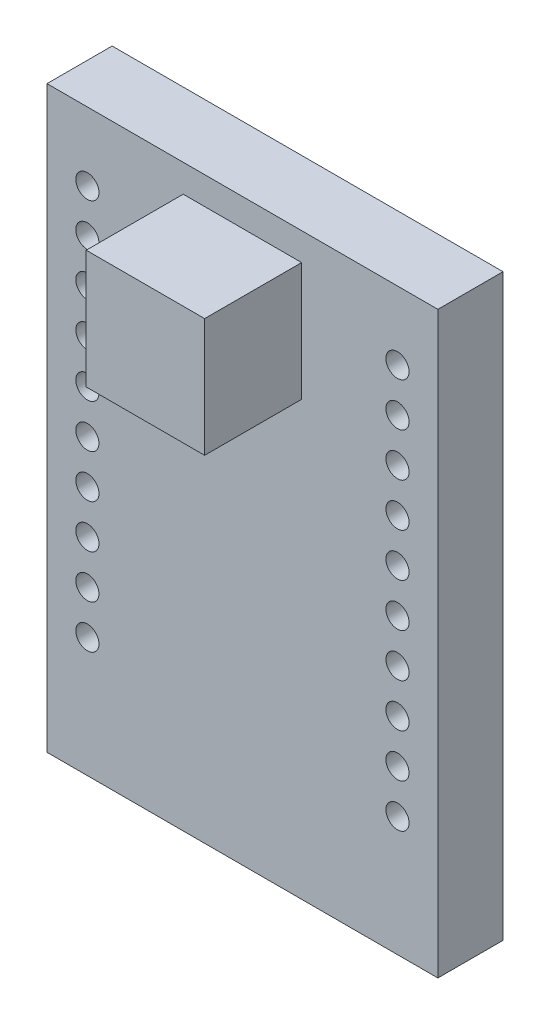
ISO-10303-21;
HEADER;
FILE_DESCRIPTION(('STEP AP214'),'2;1');
FILE_NAME('part.step','',(''),(''),'','','');
FILE_SCHEMA(('AUTOMOTIVE_DESIGN { 1 0 10303 214 1 1 1 1 }'));
ENDSEC;
DATA;
#1=APPLICATION_CONTEXT('core data for automotive mechanical design processes');
#2=APPLICATION_PROTOCOL_DEFINITION('international standard','automotive_design',2000,#1);
#3=PRODUCT_CONTEXT('',#1,'mechanical');
#4=PRODUCT('Part','Part','',(#3));
#5=PRODUCT_RELATED_PRODUCT_CATEGORY('part','',(#4));
#6=PRODUCT_DEFINITION_FORMATION('','',#4);
#7=PRODUCT_DEFINITION_CONTEXT('part definition',#1,'design');
#8=PRODUCT_DEFINITION('design','',#6,#7);
#9=PRODUCT_DEFINITION_SHAPE('','',#8);
#10=(LENGTH_UNIT() NAMED_UNIT(*) SI_UNIT(.MILLI.,.METRE.));
#11=(NAMED_UNIT(*) PLANE_ANGLE_UNIT() SI_UNIT($,.RADIAN.));
#12=(NAMED_UNIT(*) SI_UNIT($,.STERADIAN.) SOLID_ANGLE_UNIT());
#13=UNCERTAINTY_MEASURE_WITH_UNIT(LENGTH_MEASURE(1.E-05),#10,'distance_accuracy_value','');
#14=(GEOMETRIC_REPRESENTATION_CONTEXT(3) GLOBAL_UNCERTAINTY_ASSIGNED_CONTEXT((#13)) GLOBAL_UNIT_ASSIGNED_CONTEXT((#10,
#11,#12)) REPRESENTATION_CONTEXT('',''));
#15=CARTESIAN_POINT('',(0.,0.,0.));
#16=DIRECTION('',(0.,0.,1.));
#17=DIRECTION('',(1.,0.,0.));
#18=AXIS2_PLACEMENT_3D('',#15,#16,#17);
#19=CARTESIAN_POINT('',(0.,0.,4.5));
#20=DIRECTION('',(0.,0.,1.));
#21=DIRECTION('',(1.,0.,0.));
#22=AXIS2_PLACEMENT_3D('',#19,#20,#21);
#23=PLANE('',#22);
#24=CARTESIAN_POINT('',(-10.7092898997726,15.2710613434894,4.5));
#25=DIRECTION('',(0.,0.,-1.));
#26=DIRECTION('',(-1.,0.,0.));
#27=AXIS2_PLACEMENT_3D('',#24,#25,#26);
#28=CIRCLE('',#27,0.800000000000001);
#29=CARTESIAN_POINT('',(-11.5092898997726,15.2710613434894,4.5));
#30=VERTEX_POINT('',#29);
#31=EDGE_CURVE('E228',#30,#30,#28,.T.);
#32=ORIENTED_EDGE('',*,*,#31,.T.);
#33=EDGE_LOOP('',(#32));
#34=FACE_BOUND('',#33,.T.);
#35=CARTESIAN_POINT('',(-10.7092898997726,12.2710613434894,4.5));
#36=DIRECTION('',(0.,0.,-1.));
#37=DIRECTION('',(-1.,0.,0.));
#38=AXIS2_PLACEMENT_3D('',#35,#36,#37);
#39=CIRCLE('',#38,0.800000000000001);
#40=CARTESIAN_POINT('',(-11.5092898997726,12.2710613434894,4.5));
#41=VERTEX_POINT('',#40);
#42=EDGE_CURVE('E358',#41,#41,#39,.T.);
#43=ORIENTED_EDGE('',*,*,#42,.T.);
#44=EDGE_LOOP('',(#43));
#45=FACE_BOUND('',#44,.T.);
#46=CARTESIAN_POINT('',(-10.7092898997726,9.27106134348941,4.5));
#47=DIRECTION('',(0.,0.,-1.));
#48=DIRECTION('',(-1.,0.,0.));
#49=AXIS2_PLACEMENT_3D('',#46,#47,#48);
#50=CIRCLE('',#49,0.800000000000001);
#51=CARTESIAN_POINT('',(-11.5092898997726,9.27106134348941,4.5));
#52=VERTEX_POINT('',#51);
#53=EDGE_CURVE('E354',#52,#52,#50,.T.);
#54=ORIENTED_EDGE('',*,*,#53,.T.);
#55=EDGE_LOOP('',(#54));
#56=FACE_BOUND('',#55,.T.);
#57=CARTESIAN_POINT('',(-10.7092898997726,6.27106134348941,4.5));
#58=DIRECTION('',(0.,0.,-1.));
#59=DIRECTION('',(-1.,0.,0.));
#60=AXIS2_PLACEMENT_3D('',#57,#58,#59);
#61=CIRCLE('',#60,0.800000000000001);
#62=CARTESIAN_POINT('',(-11.5092898997726,6.27106134348941,4.5));
#63=VERTEX_POINT('',#62);
#64=EDGE_CURVE('E350',#63,#63,#61,.T.);
#65=ORIENTED_EDGE('',*,*,#64,.T.);
#66=EDGE_LOOP('',(#65));
#67=FACE_BOUND('',#66,.T.);
#68=CARTESIAN_POINT('',(-10.7092898997726,3.27106134348941,4.5));
#69=DIRECTION('',(0.,0.,-1.));
#70=DIRECTION('',(-1.,0.,0.));
#71=AXIS2_PLACEMENT_3D('',#68,#69,#70);
#72=CIRCLE('',#71,0.800000000000001);
#73=CARTESIAN_POINT('',(-11.5092898997726,3.27106134348941,4.5));
#74=VERTEX_POINT('',#73);
#75=EDGE_CURVE('E346',#74,#74,#72,.T.);
#76=ORIENTED_EDGE('',*,*,#75,.T.);
#77=EDGE_LOOP('',(#76));
#78=FACE_BOUND('',#77,.T.);
#79=CARTESIAN_POINT('',(-10.7092898997726,0.27106134348941,4.5));
#80=DIRECTION('',(0.,0.,-1.));
#81=DIRECTION('',(-1.,0.,0.));
#82=AXIS2_PLACEMENT_3D('',#79,#80,#81);
#83=CIRCLE('',#82,0.800000000000001);
#84=CARTESIAN_POINT('',(-11.5092898997726,0.27106134348941,4.5));
#85=VERTEX_POINT('',#84);
#86=EDGE_CURVE('E342',#85,#85,#83,.T.);
#87=ORIENTED_EDGE('',*,*,#86,.T.);
#88=EDGE_LOOP('',(#87));
#89=FACE_BOUND('',#88,.T.);
#90=CARTESIAN_POINT('',(-10.7092898997726,-2.72893865651059,4.5));
#91=DIRECTION('',(0.,0.,-1.));
#92=DIRECTION('',(-1.,0.,0.));
#93=AXIS2_PLACEMENT_3D('',#90,#91,#92);
#94=CIRCLE('',#93,0.800000000000001);
#95=CARTESIAN_POINT('',(-11.5092898997726,-2.72893865651059,4.5));
#96=VERTEX_POINT('',#95);
#97=EDGE_CURVE('E338',#96,#96,#94,.T.);
#98=ORIENTED_EDGE('',*,*,#97,.T.);
#99=EDGE_LOOP('',(#98));
#100=FACE_BOUND('',#99,.T.);
#101=CARTESIAN_POINT('',(-10.7092898997726,-5.72893865651059,4.5));
#102=DIRECTION('',(0.,0.,-1.));
#103=DIRECTION('',(-1.,0.,0.));
#104=AXIS2_PLACEMENT_3D('',#101,#102,#103);
#105=CIRCLE('',#104,0.800000000000001);
#106=CARTESIAN_POINT('',(-11.5092898997726,-5.72893865651059,4.5));
#107=VERTEX_POINT('',#106);
#108=EDGE_CURVE('E334',#107,#107,#105,.T.);
#109=ORIENTED_EDGE('',*,*,#108,.T.);
#110=EDGE_LOOP('',(#109));
#111=FACE_BOUND('',#110,.T.);
#112=CARTESIAN_POINT('',(-10.7092898997726,-8.72893865651059,4.5));
#113=DIRECTION('',(0.,0.,-1.));
#114=DIRECTION('',(-1.,0.,0.));
#115=AXIS2_PLACEMENT_3D('',#112,#113,#114);
#116=CIRCLE('',#115,0.800000000000001);
#117=CARTESIAN_POINT('',(-11.5092898997726,-8.72893865651059,4.5));
#118=VERTEX_POINT('',#117);
#119=EDGE_CURVE('E330',#118,#118,#116,.T.);
#120=ORIENTED_EDGE('',*,*,#119,.T.);
#121=EDGE_LOOP('',(#120));
#122=FACE_BOUND('',#121,.T.);
#123=CARTESIAN_POINT('',(-10.7092898997726,-11.7289386565106,4.5));
#124=DIRECTION('',(0.,0.,-1.));
#125=DIRECTION('',(-1.,0.,0.));
#126=AXIS2_PLACEMENT_3D('',#123,#124,#125);
#127=CIRCLE('',#126,0.800000000000001);
#128=CARTESIAN_POINT('',(-11.5092898997726,-11.7289386565106,4.5));
#129=VERTEX_POINT('',#128);
#130=EDGE_CURVE('E326',#129,#129,#127,.T.);
#131=ORIENTED_EDGE('',*,*,#130,.T.);
#132=EDGE_LOOP('',(#131));
#133=FACE_BOUND('',#132,.T.);
#134=CARTESIAN_POINT('',(10.7092898997726,15.2710613434894,4.5));
#135=DIRECTION('',(0.,0.,1.));
#136=DIRECTION('',(1.,0.,0.));
#137=AXIS2_PLACEMENT_3D('',#134,#135,#136);
#138=CIRCLE('',#137,0.800000000000001);
#139=CARTESIAN_POINT('',(11.5092898997726,15.2710613434894,4.5));
#140=VERTEX_POINT('',#139);
#141=EDGE_CURVE('E187',#140,#140,#138,.T.);
#142=ORIENTED_EDGE('',*,*,#141,.F.);
#143=EDGE_LOOP('',(#142));
#144=FACE_BOUND('',#143,.T.);
#145=CARTESIAN_POINT('',(10.7092898997726,12.2710613434894,4.5));
#146=DIRECTION('',(0.,0.,1.));
#147=DIRECTION('',(1.,0.,0.));
#148=AXIS2_PLACEMENT_3D('',#145,#146,#147);
#149=CIRCLE('',#148,0.800000000000001);
#150=CARTESIAN_POINT('',(11.5092898997726,12.2710613434894,4.5));
#151=VERTEX_POINT('',#150);
#152=EDGE_CURVE('E297',#151,#151,#149,.T.);
#153=ORIENTED_EDGE('',*,*,#152,.F.);
#154=EDGE_LOOP('',(#153));
#155=FACE_BOUND('',#154,.T.);
#156=CARTESIAN_POINT('',(10.7092898997726,9.27106134348941,4.5));
#157=DIRECTION('',(0.,0.,1.));
#158=DIRECTION('',(1.,0.,0.));
#159=AXIS2_PLACEMENT_3D('',#156,#157,#158);
#160=CIRCLE('',#159,0.800000000000001);
#161=CARTESIAN_POINT('',(11.5092898997726,9.27106134348941,4.5));
#162=VERTEX_POINT('',#161);
#163=EDGE_CURVE('E301',#162,#162,#160,.T.);
#164=ORIENTED_EDGE('',*,*,#163,.F.);
#165=EDGE_LOOP('',(#164));
#166=FACE_BOUND('',#165,.T.);
#167=CARTESIAN_POINT('',(10.7092898997726,6.27106134348941,4.5));
#168=DIRECTION('',(0.,0.,1.));
#169=DIRECTION('',(1.,0.,0.));
#170=AXIS2_PLACEMENT_3D('',#167,#168,#169);
#171=CIRCLE('',#170,0.800000000000001);
#172=CARTESIAN_POINT('',(11.5092898997726,6.27106134348941,4.5));
#173=VERTEX_POINT('',#172);
#174=EDGE_CURVE('E305',#173,#173,#171,.T.);
#175=ORIENTED_EDGE('',*,*,#174,.F.);
#176=EDGE_LOOP('',(#175));
#177=FACE_BOUND('',#176,.T.);
#178=CARTESIAN_POINT('',(10.7092898997726,3.27106134348941,4.5));
#179=DIRECTION('',(0.,0.,1.));
#180=DIRECTION('',(1.,0.,0.));
#181=AXIS2_PLACEMENT_3D('',#178,#179,#180);
#182=CIRCLE('',#181,0.800000000000001);
#183=CARTESIAN_POINT('',(11.5092898997726,3.27106134348941,4.5));
#184=VERTEX_POINT('',#183);
#185=EDGE_CURVE('E309',#184,#184,#182,.T.);
#186=ORIENTED_EDGE('',*,*,#185,.F.);
#187=EDGE_LOOP('',(#186));
#188=FACE_BOUND('',#187,.T.);
#189=CARTESIAN_POINT('',(10.7092898997726,0.27106134348941,4.5));
#190=DIRECTION('',(0.,0.,1.));
#191=DIRECTION('',(1.,0.,0.));
#192=AXIS2_PLACEMENT_3D('',#189,#190,#191);
#193=CIRCLE('',#192,0.800000000000001);
#194=CARTESIAN_POINT('',(11.5092898997726,0.27106134348941,4.5));
#195=VERTEX_POINT('',#194);
#196=EDGE_CURVE('E313',#195,#195,#193,.T.);
#197=ORIENTED_EDGE('',*,*,#196,.F.);
#198=EDGE_LOOP('',(#197));
#199=FACE_BOUND('',#198,.T.);
#200=CARTESIAN_POINT('',(10.7092898997726,-2.72893865651059,4.5));
#201=DIRECTION('',(0.,0.,1.));
#202=DIRECTION('',(1.,0.,0.));
#203=AXIS2_PLACEMENT_3D('',#200,#201,#202);
#204=CIRCLE('',#203,0.800000000000001);
#205=CARTESIAN_POINT('',(11.5092898997726,-2.72893865651059,4.5));
#206=VERTEX_POINT('',#205);
#207=EDGE_CURVE('E317',#206,#206,#204,.T.);
#208=ORIENTED_EDGE('',*,*,#207,.F.);
#209=EDGE_LOOP('',(#208));
#210=FACE_BOUND('',#209,.T.);
#211=CARTESIAN_POINT('',(10.7092898997726,-5.72893865651059,4.5));
#212=DIRECTION('',(0.,0.,1.));
#213=DIRECTION('',(1.,0.,0.));
#214=AXIS2_PLACEMENT_3D('',#211,#212,#213);
#215=CIRCLE('',#214,0.800000000000001);
#216=CARTESIAN_POINT('',(11.5092898997726,-5.72893865651059,4.5));
#217=VERTEX_POINT('',#216);
#218=EDGE_CURVE('E273',#217,#217,#215,.T.);
#219=ORIENTED_EDGE('',*,*,#218,.F.);
#220=EDGE_LOOP('',(#219));
#221=FACE_BOUND('',#220,.T.);
#222=CARTESIAN_POINT('',(10.7092898997726,-8.72893865651059,4.5));
#223=DIRECTION('',(0.,0.,1.));
#224=DIRECTION('',(1.,0.,0.));
#225=AXIS2_PLACEMENT_3D('',#222,#223,#224);
#226=CIRCLE('',#225,0.800000000000001);
#227=CARTESIAN_POINT('',(11.5092898997726,-8.72893865651059,4.5));
#228=VERTEX_POINT('',#227);
#229=EDGE_CURVE('E267',#228,#228,#226,.T.);
#230=ORIENTED_EDGE('',*,*,#229,.F.);
#231=EDGE_LOOP('',(#230));
#232=FACE_BOUND('',#231,.T.);
#233=CARTESIAN_POINT('',(10.7092898997726,-11.7289386565106,4.5));
#234=DIRECTION('',(0.,0.,1.));
#235=DIRECTION('',(1.,0.,0.));
#236=AXIS2_PLACEMENT_3D('',#233,#234,#235);
#237=CIRCLE('',#236,0.800000000000001);
#238=CARTESIAN_POINT('',(11.5092898997726,-11.7289386565106,4.5));
#239=VERTEX_POINT('',#238);
#240=EDGE_CURVE('E262',#239,#239,#237,.T.);
#241=ORIENTED_EDGE('',*,*,#240,.F.);
#242=EDGE_LOOP('',(#241));
#243=FACE_BOUND('',#242,.T.);
#244=DIRECTION('',(0.,1.,0.));
#245=VECTOR('',#244,1.);
#246=CARTESIAN_POINT('',(13.5,20.,4.5));
#247=LINE('',#246,#245);
#248=CARTESIAN_POINT('',(13.5,-20.,4.5));
#249=VERTEX_POINT('',#248);
#250=CARTESIAN_POINT('',(13.5,20.,4.5));
#251=VERTEX_POINT('',#250);
#252=EDGE_CURVE('E156',#249,#251,#247,.T.);
#253=ORIENTED_EDGE('',*,*,#252,.T.);
#254=DIRECTION('',(-1.,0.,0.));
#255=VECTOR('',#254,1.);
#256=CARTESIAN_POINT('',(-13.5,20.,4.5));
#257=LINE('',#256,#255);
#258=CARTESIAN_POINT('',(-13.5,20.,4.5));
#259=VERTEX_POINT('',#258);
#260=EDGE_CURVE('E96',#251,#259,#257,.T.);
#261=ORIENTED_EDGE('',*,*,#260,.T.);
#262=DIRECTION('',(0.,-1.,0.));
#263=VECTOR('',#262,1.);
#264=CARTESIAN_POINT('',(-13.5,20.,4.5));
#265=LINE('',#264,#263);
#266=CARTESIAN_POINT('',(-13.5,-20.,4.5));
#267=VERTEX_POINT('',#266);
#268=EDGE_CURVE('E161',#259,#267,#265,.T.);
#269=ORIENTED_EDGE('',*,*,#268,.T.);
#270=DIRECTION('',(1.,0.,0.));
#271=VECTOR('',#270,1.);
#272=CARTESIAN_POINT('',(-13.5,-20.,4.5));
#273=LINE('',#272,#271);
#274=EDGE_CURVE('E68',#267,#249,#273,.T.);
#275=ORIENTED_EDGE('',*,*,#274,.T.);
#276=EDGE_LOOP('',(#253,#261,#269,#275));
#277=FACE_BOUND('',#276,.T.);
#278=DIRECTION('',(-1.,0.,0.));
#279=VECTOR('',#278,1.);
#280=CARTESIAN_POINT('',(-4.09,18.09,4.5));
#281=LINE('',#280,#279);
#282=CARTESIAN_POINT('',(4.09,18.09,4.5));
#283=VERTEX_POINT('',#282);
#284=CARTESIAN_POINT('',(-4.09,18.09,4.5));
#285=VERTEX_POINT('',#284);
#286=EDGE_CURVE('E284',#283,#285,#281,.T.);
#287=ORIENTED_EDGE('',*,*,#286,.F.);
#288=DIRECTION('',(0.,1.,0.));
#289=VECTOR('',#288,1.);
#290=CARTESIAN_POINT('',(4.09,18.09,4.5));
#291=LINE('',#290,#289);
#292=CARTESIAN_POINT('',(4.09,9.91,4.5));
#293=VERTEX_POINT('',#292);
#294=EDGE_CURVE('E143',#293,#283,#291,.T.);
#295=ORIENTED_EDGE('',*,*,#294,.F.);
#296=DIRECTION('',(1.,0.,0.));
#297=VECTOR('',#296,1.);
#298=CARTESIAN_POINT('',(-4.09,9.91,4.5));
#299=LINE('',#298,#297);
#300=CARTESIAN_POINT('',(-4.09,9.91,4.5));
#301=VERTEX_POINT('',#300);
#302=EDGE_CURVE('E139',#301,#293,#299,.T.);
#303=ORIENTED_EDGE('',*,*,#302,.F.);
#304=DIRECTION('',(0.,-1.,0.));
#305=VECTOR('',#304,1.);
#306=CARTESIAN_POINT('',(-4.09,18.09,4.5));
#307=LINE('',#306,#305);
#308=EDGE_CURVE('E287',#285,#301,#307,.T.);
#309=ORIENTED_EDGE('',*,*,#308,.F.);
#310=EDGE_LOOP('',(#287,#295,#303,#309));
#311=FACE_BOUND('',#310,.T.);
#312=ADVANCED_FACE('F41',(#34,#45,#56,#67,#78,#89,#100,#111,#122,#133,#144,#155,#166,#177,#188,
#199,#210,#221,#232,#243,#277,#311),#23,.T.);
#313=CARTESIAN_POINT('',(13.5,20.,4.5));
#314=DIRECTION('',(-1.,0.,0.));
#315=DIRECTION('',(0.,-1.,0.));
#316=AXIS2_PLACEMENT_3D('',#313,#314,#315);
#317=PLANE('',#316);
#318=DIRECTION('',(0.,1.,0.));
#319=VECTOR('',#318,1.);
#320=CARTESIAN_POINT('',(13.5,20.,0.));
#321=LINE('',#320,#319);
#322=CARTESIAN_POINT('',(13.5,-20.,0.));
#323=VERTEX_POINT('',#322);
#324=CARTESIAN_POINT('',(13.5,20.,0.));
#325=VERTEX_POINT('',#324);
#326=EDGE_CURVE('E146',#323,#325,#321,.T.);
#327=ORIENTED_EDGE('',*,*,#326,.T.);
#328=DIRECTION('',(0.,0.,-1.));
#329=VECTOR('',#328,1.);
#330=CARTESIAN_POINT('',(13.5,20.,4.5));
#331=LINE('',#330,#329);
#332=EDGE_CURVE('E11',#251,#325,#331,.T.);
#333=ORIENTED_EDGE('',*,*,#332,.F.);
#334=ORIENTED_EDGE('',*,*,#252,.F.);
#335=DIRECTION('',(0.,0.,-1.));
#336=VECTOR('',#335,1.);
#337=CARTESIAN_POINT('',(13.5,-20.,4.5));
#338=LINE('',#337,#336);
#339=EDGE_CURVE('E165',#249,#323,#338,.T.);
#340=ORIENTED_EDGE('',*,*,#339,.T.);
#341=EDGE_LOOP('',(#327,#333,#334,#340));
#342=FACE_BOUND('',#341,.T.);
#343=ADVANCED_FACE('F43',(#342),#317,.F.);
#344=CARTESIAN_POINT('',(-13.5,20.,4.5));
#345=DIRECTION('',(0.,-1.,0.));
#346=DIRECTION('',(0.,0.,-1.));
#347=AXIS2_PLACEMENT_3D('',#344,#345,#346);
#348=PLANE('',#347);
#349=DIRECTION('',(-1.,0.,0.));
#350=VECTOR('',#349,1.);
#351=CARTESIAN_POINT('',(-13.5,20.,0.));
#352=LINE('',#351,#350);
#353=CARTESIAN_POINT('',(-13.5,20.,0.));
#354=VERTEX_POINT('',#353);
#355=EDGE_CURVE('E151',#325,#354,#352,.T.);
#356=ORIENTED_EDGE('',*,*,#355,.T.);
#357=DIRECTION('',(0.,0.,-1.));
#358=VECTOR('',#357,1.);
#359=CARTESIAN_POINT('',(-13.5,20.,4.5));
#360=LINE('',#359,#358);
#361=EDGE_CURVE('E51',#259,#354,#360,.T.);
#362=ORIENTED_EDGE('',*,*,#361,.F.);
#363=ORIENTED_EDGE('',*,*,#260,.F.);
#364=ORIENTED_EDGE('',*,*,#332,.T.);
#365=EDGE_LOOP('',(#356,#362,#363,#364));
#366=FACE_BOUND('',#365,.T.);
#367=ADVANCED_FACE('F383',(#366),#348,.F.);
#368=CARTESIAN_POINT('',(-13.5,20.,4.5));
#369=DIRECTION('',(1.,0.,0.));
#370=DIRECTION('',(0.,1.,0.));
#371=AXIS2_PLACEMENT_3D('',#368,#369,#370);
#372=PLANE('',#371);
#373=DIRECTION('',(0.,-1.,0.));
#374=VECTOR('',#373,1.);
#375=CARTESIAN_POINT('',(-13.5,20.,0.));
#376=LINE('',#375,#374);
#377=CARTESIAN_POINT('',(-13.5,-20.,0.));
#378=VERTEX_POINT('',#377);
#379=EDGE_CURVE('E169',#354,#378,#376,.T.);
#380=ORIENTED_EDGE('',*,*,#379,.T.);
#381=DIRECTION('',(0.,0.,-1.));
#382=VECTOR('',#381,1.);
#383=CARTESIAN_POINT('',(-13.5,-20.,4.5));
#384=LINE('',#383,#382);
#385=EDGE_CURVE('E176',#267,#378,#384,.T.);
#386=ORIENTED_EDGE('',*,*,#385,.F.);
#387=ORIENTED_EDGE('',*,*,#268,.F.);
#388=ORIENTED_EDGE('',*,*,#361,.T.);
#389=EDGE_LOOP('',(#380,#386,#387,#388));
#390=FACE_BOUND('',#389,.T.);
#391=ADVANCED_FACE('F395',(#390),#372,.F.);
#392=CARTESIAN_POINT('',(-13.5,-20.,4.5));
#393=DIRECTION('',(0.,1.,0.));
#394=DIRECTION('',(0.,0.,1.));
#395=AXIS2_PLACEMENT_3D('',#392,#393,#394);
#396=PLANE('',#395);
#397=DIRECTION('',(1.,0.,0.));
#398=VECTOR('',#397,1.);
#399=CARTESIAN_POINT('',(-13.5,-20.,0.));
#400=LINE('',#399,#398);
#401=EDGE_CURVE('E89',#378,#323,#400,.T.);
#402=ORIENTED_EDGE('',*,*,#401,.T.);
#403=ORIENTED_EDGE('',*,*,#339,.F.);
#404=ORIENTED_EDGE('',*,*,#274,.F.);
#405=ORIENTED_EDGE('',*,*,#385,.T.);
#406=EDGE_LOOP('',(#402,#403,#404,#405));
#407=FACE_BOUND('',#406,.T.);
#408=ADVANCED_FACE('F391',(#407),#396,.F.);
#409=CARTESIAN_POINT('',(0.,0.,0.));
#410=DIRECTION('',(0.,0.,1.));
#411=DIRECTION('',(1.,0.,0.));
#412=AXIS2_PLACEMENT_3D('',#409,#410,#411);
#413=PLANE('',#412);
#414=CARTESIAN_POINT('',(-10.7092898997726,15.2710613434894,0.));
#415=DIRECTION('',(0.,0.,1.));
#416=DIRECTION('',(1.,0.,0.));
#417=AXIS2_PLACEMENT_3D('',#414,#415,#416);
#418=CIRCLE('',#417,0.800000000000001);
#419=CARTESIAN_POINT('',(-9.90928989977261,15.2710613434894,0.));
#420=VERTEX_POINT('',#419);
#421=EDGE_CURVE('E45',#420,#420,#418,.F.);
#422=ORIENTED_EDGE('',*,*,#421,.F.);
#423=EDGE_LOOP('',(#422));
#424=FACE_BOUND('',#423,.T.);
#425=CARTESIAN_POINT('',(-10.7092898997726,12.2710613434894,0.));
#426=DIRECTION('',(0.,0.,1.));
#427=DIRECTION('',(1.,0.,0.));
#428=AXIS2_PLACEMENT_3D('',#425,#426,#427);
#429=CIRCLE('',#428,0.800000000000001);
#430=CARTESIAN_POINT('',(-9.90928989977261,12.2710613434894,0.));
#431=VERTEX_POINT('',#430);
#432=EDGE_CURVE('E255',#431,#431,#429,.F.);
#433=ORIENTED_EDGE('',*,*,#432,.F.);
#434=EDGE_LOOP('',(#433));
#435=FACE_BOUND('',#434,.T.);
#436=CARTESIAN_POINT('',(-10.7092898997726,9.27106134348941,0.));
#437=DIRECTION('',(0.,0.,1.));
#438=DIRECTION('',(1.,0.,0.));
#439=AXIS2_PLACEMENT_3D('',#436,#437,#438);
#440=CIRCLE('',#439,0.800000000000001);
#441=CARTESIAN_POINT('',(-9.90928989977262,9.27106134348941,0.));
#442=VERTEX_POINT('',#441);
#443=EDGE_CURVE('E252',#442,#442,#440,.F.);
#444=ORIENTED_EDGE('',*,*,#443,.F.);
#445=EDGE_LOOP('',(#444));
#446=FACE_BOUND('',#445,.T.);
#447=CARTESIAN_POINT('',(-10.7092898997726,6.27106134348941,0.));
#448=DIRECTION('',(0.,0.,1.));
#449=DIRECTION('',(1.,0.,0.));
#450=AXIS2_PLACEMENT_3D('',#447,#448,#449);
#451=CIRCLE('',#450,0.800000000000001);
#452=CARTESIAN_POINT('',(-9.90928989977262,6.27106134348941,0.));
#453=VERTEX_POINT('',#452);
#454=EDGE_CURVE('E248',#453,#453,#451,.F.);
#455=ORIENTED_EDGE('',*,*,#454,.F.);
#456=EDGE_LOOP('',(#455));
#457=FACE_BOUND('',#456,.T.);
#458=CARTESIAN_POINT('',(-10.7092898997726,3.27106134348941,0.));
#459=DIRECTION('',(0.,0.,1.));
#460=DIRECTION('',(1.,0.,0.));
#461=AXIS2_PLACEMENT_3D('',#458,#459,#460);
#462=CIRCLE('',#461,0.800000000000001);
#463=CARTESIAN_POINT('',(-9.90928989977262,3.27106134348941,0.));
#464=VERTEX_POINT('',#463);
#465=EDGE_CURVE('E244',#464,#464,#462,.F.);
#466=ORIENTED_EDGE('',*,*,#465,.F.);
#467=EDGE_LOOP('',(#466));
#468=FACE_BOUND('',#467,.T.);
#469=CARTESIAN_POINT('',(-10.7092898997726,0.27106134348941,0.));
#470=DIRECTION('',(0.,0.,1.));
#471=DIRECTION('',(1.,0.,0.));
#472=AXIS2_PLACEMENT_3D('',#469,#470,#471);
#473=CIRCLE('',#472,0.800000000000001);
#474=CARTESIAN_POINT('',(-9.90928989977262,0.27106134348941,0.));
#475=VERTEX_POINT('',#474);
#476=EDGE_CURVE('E240',#475,#475,#473,.F.);
#477=ORIENTED_EDGE('',*,*,#476,.F.);
#478=EDGE_LOOP('',(#477));
#479=FACE_BOUND('',#478,.T.);
#480=CARTESIAN_POINT('',(-10.7092898997726,-2.72893865651059,0.));
#481=DIRECTION('',(0.,0.,1.));
#482=DIRECTION('',(1.,0.,0.));
#483=AXIS2_PLACEMENT_3D('',#480,#481,#482);
#484=CIRCLE('',#483,0.800000000000001);
#485=CARTESIAN_POINT('',(-9.90928989977262,-2.72893865651059,0.));
#486=VERTEX_POINT('',#485);
#487=EDGE_CURVE('E236',#486,#486,#484,.F.);
#488=ORIENTED_EDGE('',*,*,#487,.F.);
#489=EDGE_LOOP('',(#488));
#490=FACE_BOUND('',#489,.T.);
#491=CARTESIAN_POINT('',(-10.7092898997726,-5.72893865651059,0.));
#492=DIRECTION('',(0.,0.,1.));
#493=DIRECTION('',(1.,0.,0.));
#494=AXIS2_PLACEMENT_3D('',#491,#492,#493);
#495=CIRCLE('',#494,0.800000000000001);
#496=CARTESIAN_POINT('',(-9.90928989977262,-5.72893865651059,0.));
#497=VERTEX_POINT('',#496);
#498=EDGE_CURVE('E232',#497,#497,#495,.F.);
#499=ORIENTED_EDGE('',*,*,#498,.F.);
#500=EDGE_LOOP('',(#499));
#501=FACE_BOUND('',#500,.T.);
#502=CARTESIAN_POINT('',(-10.7092898997726,-8.72893865651059,0.));
#503=DIRECTION('',(0.,0.,1.));
#504=DIRECTION('',(1.,0.,0.));
#505=AXIS2_PLACEMENT_3D('',#502,#503,#504);
#506=CIRCLE('',#505,0.800000000000001);
#507=CARTESIAN_POINT('',(-9.90928989977263,-8.72893865651059,0.));
#508=VERTEX_POINT('',#507);
#509=EDGE_CURVE('E227',#508,#508,#506,.F.);
#510=ORIENTED_EDGE('',*,*,#509,.F.);
#511=EDGE_LOOP('',(#510));
#512=FACE_BOUND('',#511,.T.);
#513=CARTESIAN_POINT('',(-10.7092898997726,-11.7289386565106,0.));
#514=DIRECTION('',(0.,0.,1.));
#515=DIRECTION('',(1.,0.,0.));
#516=AXIS2_PLACEMENT_3D('',#513,#514,#515);
#517=CIRCLE('',#516,0.800000000000001);
#518=CARTESIAN_POINT('',(-9.90928989977263,-11.7289386565106,0.));
#519=VERTEX_POINT('',#518);
#520=EDGE_CURVE('E223',#519,#519,#517,.F.);
#521=ORIENTED_EDGE('',*,*,#520,.F.);
#522=EDGE_LOOP('',(#521));
#523=FACE_BOUND('',#522,.T.);
#524=CARTESIAN_POINT('',(10.7092898997726,15.2710613434894,0.));
#525=DIRECTION('',(0.,0.,1.));
#526=DIRECTION('',(1.,0.,0.));
#527=AXIS2_PLACEMENT_3D('',#524,#525,#526);
#528=CIRCLE('',#527,0.800000000000001);
#529=CARTESIAN_POINT('',(11.5092898997726,15.2710613434894,0.));
#530=VERTEX_POINT('',#529);
#531=EDGE_CURVE('E219',#530,#530,#528,.T.);
#532=ORIENTED_EDGE('',*,*,#531,.T.);
#533=EDGE_LOOP('',(#532));
#534=FACE_BOUND('',#533,.T.);
#535=CARTESIAN_POINT('',(10.7092898997726,12.2710613434894,0.));
#536=DIRECTION('',(0.,0.,1.));
#537=DIRECTION('',(1.,0.,0.));
#538=AXIS2_PLACEMENT_3D('',#535,#536,#537);
#539=CIRCLE('',#538,0.800000000000001);
#540=CARTESIAN_POINT('',(11.5092898997726,12.2710613434894,0.));
#541=VERTEX_POINT('',#540);
#542=EDGE_CURVE('E215',#541,#541,#539,.T.);
#543=ORIENTED_EDGE('',*,*,#542,.T.);
#544=EDGE_LOOP('',(#543));
#545=FACE_BOUND('',#544,.T.);
#546=CARTESIAN_POINT('',(10.7092898997726,9.27106134348941,0.));
#547=DIRECTION('',(0.,0.,1.));
#548=DIRECTION('',(1.,0.,0.));
#549=AXIS2_PLACEMENT_3D('',#546,#547,#548);
#550=CIRCLE('',#549,0.800000000000001);
#551=CARTESIAN_POINT('',(11.5092898997726,9.27106134348941,0.));
#552=VERTEX_POINT('',#551);
#553=EDGE_CURVE('E211',#552,#552,#550,.T.);
#554=ORIENTED_EDGE('',*,*,#553,.T.);
#555=EDGE_LOOP('',(#554));
#556=FACE_BOUND('',#555,.T.);
#557=CARTESIAN_POINT('',(10.7092898997726,6.27106134348941,0.));
#558=DIRECTION('',(0.,0.,1.));
#559=DIRECTION('',(1.,0.,0.));
#560=AXIS2_PLACEMENT_3D('',#557,#558,#559);
#561=CIRCLE('',#560,0.800000000000001);
#562=CARTESIAN_POINT('',(11.5092898997726,6.27106134348941,0.));
#563=VERTEX_POINT('',#562);
#564=EDGE_CURVE('E207',#563,#563,#561,.T.);
#565=ORIENTED_EDGE('',*,*,#564,.T.);
#566=EDGE_LOOP('',(#565));
#567=FACE_BOUND('',#566,.T.);
#568=CARTESIAN_POINT('',(10.7092898997726,3.27106134348941,0.));
#569=DIRECTION('',(0.,0.,1.));
#570=DIRECTION('',(1.,0.,0.));
#571=AXIS2_PLACEMENT_3D('',#568,#569,#570);
#572=CIRCLE('',#571,0.800000000000001);
#573=CARTESIAN_POINT('',(11.5092898997726,3.27106134348941,0.));
#574=VERTEX_POINT('',#573);
#575=EDGE_CURVE('E203',#574,#574,#572,.T.);
#576=ORIENTED_EDGE('',*,*,#575,.T.);
#577=EDGE_LOOP('',(#576));
#578=FACE_BOUND('',#577,.T.);
#579=CARTESIAN_POINT('',(10.7092898997726,0.27106134348941,0.));
#580=DIRECTION('',(0.,0.,1.));
#581=DIRECTION('',(1.,0.,0.));
#582=AXIS2_PLACEMENT_3D('',#579,#580,#581);
#583=CIRCLE('',#582,0.800000000000001);
#584=CARTESIAN_POINT('',(11.5092898997726,0.27106134348941,0.));
#585=VERTEX_POINT('',#584);
#586=EDGE_CURVE('E199',#585,#585,#583,.T.);
#587=ORIENTED_EDGE('',*,*,#586,.T.);
#588=EDGE_LOOP('',(#587));
#589=FACE_BOUND('',#588,.T.);
#590=CARTESIAN_POINT('',(10.7092898997726,-2.72893865651059,0.));
#591=DIRECTION('',(0.,0.,1.));
#592=DIRECTION('',(1.,0.,0.));
#593=AXIS2_PLACEMENT_3D('',#590,#591,#592);
#594=CIRCLE('',#593,0.800000000000001);
#595=CARTESIAN_POINT('',(11.5092898997726,-2.72893865651059,0.));
#596=VERTEX_POINT('',#595);
#597=EDGE_CURVE('E195',#596,#596,#594,.T.);
#598=ORIENTED_EDGE('',*,*,#597,.T.);
#599=EDGE_LOOP('',(#598));
#600=FACE_BOUND('',#599,.T.);
#601=CARTESIAN_POINT('',(10.7092898997726,-5.72893865651059,0.));
#602=DIRECTION('',(0.,0.,1.));
#603=DIRECTION('',(1.,0.,0.));
#604=AXIS2_PLACEMENT_3D('',#601,#602,#603);
#605=CIRCLE('',#604,0.800000000000001);
#606=CARTESIAN_POINT('',(11.5092898997726,-5.72893865651059,0.));
#607=VERTEX_POINT('',#606);
#608=EDGE_CURVE('E191',#607,#607,#605,.T.);
#609=ORIENTED_EDGE('',*,*,#608,.T.);
#610=EDGE_LOOP('',(#609));
#611=FACE_BOUND('',#610,.T.);
#612=CARTESIAN_POINT('',(10.7092898997726,-8.72893865651059,0.));
#613=DIRECTION('',(0.,0.,1.));
#614=DIRECTION('',(1.,0.,0.));
#615=AXIS2_PLACEMENT_3D('',#612,#613,#614);
#616=CIRCLE('',#615,0.800000000000001);
#617=CARTESIAN_POINT('',(11.5092898997726,-8.72893865651059,0.));
#618=VERTEX_POINT('',#617);
#619=EDGE_CURVE('E186',#618,#618,#616,.T.);
#620=ORIENTED_EDGE('',*,*,#619,.T.);
#621=EDGE_LOOP('',(#620));
#622=FACE_BOUND('',#621,.T.);
#623=CARTESIAN_POINT('',(10.7092898997726,-11.7289386565106,0.));
#624=DIRECTION('',(0.,0.,1.));
#625=DIRECTION('',(1.,0.,0.));
#626=AXIS2_PLACEMENT_3D('',#623,#624,#625);
#627=CIRCLE('',#626,0.800000000000001);
#628=CARTESIAN_POINT('',(11.5092898997726,-11.7289386565106,0.));
#629=VERTEX_POINT('',#628);
#630=EDGE_CURVE('E182',#629,#629,#627,.T.);
#631=ORIENTED_EDGE('',*,*,#630,.T.);
#632=EDGE_LOOP('',(#631));
#633=FACE_BOUND('',#632,.T.);
#634=ORIENTED_EDGE('',*,*,#326,.F.);
#635=ORIENTED_EDGE('',*,*,#401,.F.);
#636=ORIENTED_EDGE('',*,*,#379,.F.);
#637=ORIENTED_EDGE('',*,*,#355,.F.);
#638=EDGE_LOOP('',(#634,#635,#636,#637));
#639=FACE_BOUND('',#638,.T.);
#640=ADVANCED_FACE('F388',(#424,#435,#446,#457,#468,#479,#490,#501,#512,#523,#534,#545,#556,
#567,#578,#589,#600,#611,#622,#633,#639),#413,.F.);
#641=CARTESIAN_POINT('',(4.09,18.09,11.2));
#642=DIRECTION('',(-1.,0.,0.));
#643=DIRECTION('',(0.,-1.,0.));
#644=AXIS2_PLACEMENT_3D('',#641,#642,#643);
#645=PLANE('',#644);
#646=ORIENTED_EDGE('',*,*,#294,.T.);
#647=DIRECTION('',(0.,0.,-1.));
#648=VECTOR('',#647,1.);
#649=CARTESIAN_POINT('',(4.09,18.09,11.2));
#650=LINE('',#649,#648);
#651=CARTESIAN_POINT('',(4.09,18.09,11.2));
#652=VERTEX_POINT('',#651);
#653=EDGE_CURVE('E122',#652,#283,#650,.T.);
#654=ORIENTED_EDGE('',*,*,#653,.F.);
#655=DIRECTION('',(0.,1.,0.));
#656=VECTOR('',#655,1.);
#657=CARTESIAN_POINT('',(4.09,18.09,11.2));
#658=LINE('',#657,#656);
#659=CARTESIAN_POINT('',(4.09,9.91,11.2));
#660=VERTEX_POINT('',#659);
#661=EDGE_CURVE('E130',#660,#652,#658,.T.);
#662=ORIENTED_EDGE('',*,*,#661,.F.);
#663=DIRECTION('',(0.,0.,-1.));
#664=VECTOR('',#663,1.);
#665=CARTESIAN_POINT('',(4.09,9.91,11.2));
#666=LINE('',#665,#664);
#667=EDGE_CURVE('E281',#660,#293,#666,.T.);
#668=ORIENTED_EDGE('',*,*,#667,.T.);
#669=EDGE_LOOP('',(#646,#654,#662,#668));
#670=FACE_BOUND('',#669,.T.);
#671=ADVANCED_FACE('F141',(#670),#645,.F.);
#672=CARTESIAN_POINT('',(-4.09,18.09,11.2));
#673=DIRECTION('',(0.,-1.,0.));
#674=DIRECTION('',(0.,0.,-1.));
#675=AXIS2_PLACEMENT_3D('',#672,#673,#674);
#676=PLANE('',#675);
#677=ORIENTED_EDGE('',*,*,#286,.T.);
#678=DIRECTION('',(0.,0.,-1.));
#679=VECTOR('',#678,1.);
#680=CARTESIAN_POINT('',(-4.09,18.09,11.2));
#681=LINE('',#680,#679);
#682=CARTESIAN_POINT('',(-4.09,18.09,11.2));
#683=VERTEX_POINT('',#682);
#684=EDGE_CURVE('E125',#683,#285,#681,.T.);
#685=ORIENTED_EDGE('',*,*,#684,.F.);
#686=DIRECTION('',(-1.,0.,0.));
#687=VECTOR('',#686,1.);
#688=CARTESIAN_POINT('',(-4.09,18.09,11.2));
#689=LINE('',#688,#687);
#690=EDGE_CURVE('E118',#652,#683,#689,.T.);
#691=ORIENTED_EDGE('',*,*,#690,.F.);
#692=ORIENTED_EDGE('',*,*,#653,.T.);
#693=EDGE_LOOP('',(#677,#685,#691,#692));
#694=FACE_BOUND('',#693,.T.);
#695=ADVANCED_FACE('F120',(#694),#676,.F.);
#696=CARTESIAN_POINT('',(-4.09,18.09,11.2));
#697=DIRECTION('',(1.,0.,0.));
#698=DIRECTION('',(0.,1.,0.));
#699=AXIS2_PLACEMENT_3D('',#696,#697,#698);
#700=PLANE('',#699);
#701=ORIENTED_EDGE('',*,*,#308,.T.);
#702=DIRECTION('',(0.,0.,-1.));
#703=VECTOR('',#702,1.);
#704=CARTESIAN_POINT('',(-4.09,9.91,11.2));
#705=LINE('',#704,#703);
#706=CARTESIAN_POINT('',(-4.09,9.91,11.2));
#707=VERTEX_POINT('',#706);
#708=EDGE_CURVE('E59',#707,#301,#705,.T.);
#709=ORIENTED_EDGE('',*,*,#708,.F.);
#710=DIRECTION('',(0.,-1.,0.));
#711=VECTOR('',#710,1.);
#712=CARTESIAN_POINT('',(-4.09,18.09,11.2));
#713=LINE('',#712,#711);
#714=EDGE_CURVE('E129',#683,#707,#713,.T.);
#715=ORIENTED_EDGE('',*,*,#714,.F.);
#716=ORIENTED_EDGE('',*,*,#684,.T.);
#717=EDGE_LOOP('',(#701,#709,#715,#716));
#718=FACE_BOUND('',#717,.T.);
#719=ADVANCED_FACE('F412',(#718),#700,.F.);
#720=CARTESIAN_POINT('',(-4.09,9.91,11.2));
#721=DIRECTION('',(0.,1.,0.));
#722=DIRECTION('',(0.,0.,1.));
#723=AXIS2_PLACEMENT_3D('',#720,#721,#722);
#724=PLANE('',#723);
#725=ORIENTED_EDGE('',*,*,#302,.T.);
#726=ORIENTED_EDGE('',*,*,#667,.F.);
#727=DIRECTION('',(1.,0.,0.));
#728=VECTOR('',#727,1.);
#729=CARTESIAN_POINT('',(-4.09,9.91,11.2));
#730=LINE('',#729,#728);
#731=EDGE_CURVE('E134',#707,#660,#730,.T.);
#732=ORIENTED_EDGE('',*,*,#731,.F.);
#733=ORIENTED_EDGE('',*,*,#708,.T.);
#734=EDGE_LOOP('',(#725,#726,#732,#733));
#735=FACE_BOUND('',#734,.T.);
#736=ADVANCED_FACE('F413',(#735),#724,.F.);
#737=CARTESIAN_POINT('',(0.,0.,11.2));
#738=DIRECTION('',(0.,0.,1.));
#739=DIRECTION('',(1.,0.,0.));
#740=AXIS2_PLACEMENT_3D('',#737,#738,#739);
#741=PLANE('',#740);
#742=ORIENTED_EDGE('',*,*,#661,.T.);
#743=ORIENTED_EDGE('',*,*,#690,.T.);
#744=ORIENTED_EDGE('',*,*,#714,.T.);
#745=ORIENTED_EDGE('',*,*,#731,.T.);
#746=EDGE_LOOP('',(#742,#743,#744,#745));
#747=FACE_BOUND('',#746,.T.);
#748=ADVANCED_FACE('F133',(#747),#741,.T.);
#749=CARTESIAN_POINT('',(10.7092898997726,-11.7289386565106,-2.2));
#750=DIRECTION('',(0.,0.,1.));
#751=DIRECTION('',(1.,0.,0.));
#752=AXIS2_PLACEMENT_3D('',#749,#750,#751);
#753=CYLINDRICAL_SURFACE('',#752,0.800000000000001);
#754=ORIENTED_EDGE('',*,*,#240,.T.);
#755=EDGE_LOOP('',(#754));
#756=FACE_BOUND('',#755,.T.);
#757=ORIENTED_EDGE('',*,*,#630,.F.);
#758=EDGE_LOOP('',(#757));
#759=FACE_BOUND('',#758,.T.);
#760=ADVANCED_FACE('F420',(#756,#759),#753,.F.);
#761=CARTESIAN_POINT('',(10.7092898997726,-8.72893865651059,-2.2));
#762=DIRECTION('',(0.,0.,1.));
#763=DIRECTION('',(1.,0.,0.));
#764=AXIS2_PLACEMENT_3D('',#761,#762,#763);
#765=CYLINDRICAL_SURFACE('',#764,0.800000000000001);
#766=ORIENTED_EDGE('',*,*,#229,.T.);
#767=EDGE_LOOP('',(#766));
#768=FACE_BOUND('',#767,.T.);
#769=ORIENTED_EDGE('',*,*,#619,.F.);
#770=EDGE_LOOP('',(#769));
#771=FACE_BOUND('',#770,.T.);
#772=ADVANCED_FACE('F493',(#768,#771),#765,.F.);
#773=CARTESIAN_POINT('',(10.7092898997726,-5.72893865651059,-2.2));
#774=DIRECTION('',(0.,0.,1.));
#775=DIRECTION('',(1.,0.,0.));
#776=AXIS2_PLACEMENT_3D('',#773,#774,#775);
#777=CYLINDRICAL_SURFACE('',#776,0.800000000000001);
#778=ORIENTED_EDGE('',*,*,#218,.T.);
#779=EDGE_LOOP('',(#778));
#780=FACE_BOUND('',#779,.T.);
#781=ORIENTED_EDGE('',*,*,#608,.F.);
#782=EDGE_LOOP('',(#781));
#783=FACE_BOUND('',#782,.T.);
#784=ADVANCED_FACE('F500',(#780,#783),#777,.F.);
#785=CARTESIAN_POINT('',(10.7092898997726,-2.72893865651059,-2.2));
#786=DIRECTION('',(0.,0.,1.));
#787=DIRECTION('',(1.,0.,0.));
#788=AXIS2_PLACEMENT_3D('',#785,#786,#787);
#789=CYLINDRICAL_SURFACE('',#788,0.800000000000001);
#790=ORIENTED_EDGE('',*,*,#207,.T.);
#791=EDGE_LOOP('',(#790));
#792=FACE_BOUND('',#791,.T.);
#793=ORIENTED_EDGE('',*,*,#597,.F.);
#794=EDGE_LOOP('',(#793));
#795=FACE_BOUND('',#794,.T.);
#796=ADVANCED_FACE('F509',(#792,#795),#789,.F.);
#797=CARTESIAN_POINT('',(10.7092898997726,0.27106134348941,-2.2));
#798=DIRECTION('',(0.,0.,1.));
#799=DIRECTION('',(1.,0.,0.));
#800=AXIS2_PLACEMENT_3D('',#797,#798,#799);
#801=CYLINDRICAL_SURFACE('',#800,0.800000000000001);
#802=ORIENTED_EDGE('',*,*,#196,.T.);
#803=EDGE_LOOP('',(#802));
#804=FACE_BOUND('',#803,.T.);
#805=ORIENTED_EDGE('',*,*,#586,.F.);
#806=EDGE_LOOP('',(#805));
#807=FACE_BOUND('',#806,.T.);
#808=ADVANCED_FACE('F517',(#804,#807),#801,.F.);
#809=CARTESIAN_POINT('',(10.7092898997726,3.27106134348941,-2.2));
#810=DIRECTION('',(0.,0.,1.));
#811=DIRECTION('',(1.,0.,0.));
#812=AXIS2_PLACEMENT_3D('',#809,#810,#811);
#813=CYLINDRICAL_SURFACE('',#812,0.800000000000001);
#814=ORIENTED_EDGE('',*,*,#185,.T.);
#815=EDGE_LOOP('',(#814));
#816=FACE_BOUND('',#815,.T.);
#817=ORIENTED_EDGE('',*,*,#575,.F.);
#818=EDGE_LOOP('',(#817));
#819=FACE_BOUND('',#818,.T.);
#820=ADVANCED_FACE('F526',(#816,#819),#813,.F.);
#821=CARTESIAN_POINT('',(10.7092898997726,6.27106134348941,-2.2));
#822=DIRECTION('',(0.,0.,1.));
#823=DIRECTION('',(1.,0.,0.));
#824=AXIS2_PLACEMENT_3D('',#821,#822,#823);
#825=CYLINDRICAL_SURFACE('',#824,0.800000000000001);
#826=ORIENTED_EDGE('',*,*,#174,.T.);
#827=EDGE_LOOP('',(#826));
#828=FACE_BOUND('',#827,.T.);
#829=ORIENTED_EDGE('',*,*,#564,.F.);
#830=EDGE_LOOP('',(#829));
#831=FACE_BOUND('',#830,.T.);
#832=ADVANCED_FACE('F535',(#828,#831),#825,.F.);
#833=CARTESIAN_POINT('',(10.7092898997726,9.27106134348941,-2.2));
#834=DIRECTION('',(0.,0.,1.));
#835=DIRECTION('',(1.,0.,0.));
#836=AXIS2_PLACEMENT_3D('',#833,#834,#835);
#837=CYLINDRICAL_SURFACE('',#836,0.800000000000001);
#838=ORIENTED_EDGE('',*,*,#163,.T.);
#839=EDGE_LOOP('',(#838));
#840=FACE_BOUND('',#839,.T.);
#841=ORIENTED_EDGE('',*,*,#553,.F.);
#842=EDGE_LOOP('',(#841));
#843=FACE_BOUND('',#842,.T.);
#844=ADVANCED_FACE('F544',(#840,#843),#837,.F.);
#845=CARTESIAN_POINT('',(10.7092898997726,12.2710613434894,-2.2));
#846=DIRECTION('',(0.,0.,1.));
#847=DIRECTION('',(1.,0.,0.));
#848=AXIS2_PLACEMENT_3D('',#845,#846,#847);
#849=CYLINDRICAL_SURFACE('',#848,0.800000000000001);
#850=ORIENTED_EDGE('',*,*,#152,.T.);
#851=EDGE_LOOP('',(#850));
#852=FACE_BOUND('',#851,.T.);
#853=ORIENTED_EDGE('',*,*,#542,.F.);
#854=EDGE_LOOP('',(#853));
#855=FACE_BOUND('',#854,.T.);
#856=ADVANCED_FACE('F553',(#852,#855),#849,.F.);
#857=CARTESIAN_POINT('',(10.7092898997726,15.2710613434894,-2.2));
#858=DIRECTION('',(0.,0.,1.));
#859=DIRECTION('',(1.,0.,0.));
#860=AXIS2_PLACEMENT_3D('',#857,#858,#859);
#861=CYLINDRICAL_SURFACE('',#860,0.800000000000001);
#862=ORIENTED_EDGE('',*,*,#141,.T.);
#863=EDGE_LOOP('',(#862));
#864=FACE_BOUND('',#863,.T.);
#865=ORIENTED_EDGE('',*,*,#531,.F.);
#866=EDGE_LOOP('',(#865));
#867=FACE_BOUND('',#866,.T.);
#868=ADVANCED_FACE('F562',(#864,#867),#861,.F.);
#869=CARTESIAN_POINT('',(-10.7092898997726,-11.7289386565106,-2.2));
#870=DIRECTION('',(0.,0.,1.));
#871=DIRECTION('',(1.,0.,0.));
#872=AXIS2_PLACEMENT_3D('',#869,#870,#871);
#873=CYLINDRICAL_SURFACE('',#872,0.800000000000001);
#874=ORIENTED_EDGE('',*,*,#130,.F.);
#875=EDGE_LOOP('',(#874));
#876=FACE_BOUND('',#875,.T.);
#877=ORIENTED_EDGE('',*,*,#520,.T.);
#878=EDGE_LOOP('',(#877));
#879=FACE_BOUND('',#878,.T.);
#880=ADVANCED_FACE('F570',(#876,#879),#873,.F.);
#881=CARTESIAN_POINT('',(-10.7092898997726,-8.72893865651059,-2.2));
#882=DIRECTION('',(0.,0.,1.));
#883=DIRECTION('',(1.,0.,0.));
#884=AXIS2_PLACEMENT_3D('',#881,#882,#883);
#885=CYLINDRICAL_SURFACE('',#884,0.800000000000001);
#886=ORIENTED_EDGE('',*,*,#119,.F.);
#887=EDGE_LOOP('',(#886));
#888=FACE_BOUND('',#887,.T.);
#889=ORIENTED_EDGE('',*,*,#509,.T.);
#890=EDGE_LOOP('',(#889));
#891=FACE_BOUND('',#890,.T.);
#892=ADVANCED_FACE('F578',(#888,#891),#885,.F.);
#893=CARTESIAN_POINT('',(-10.7092898997726,-5.72893865651059,-2.2));
#894=DIRECTION('',(0.,0.,1.));
#895=DIRECTION('',(1.,0.,0.));
#896=AXIS2_PLACEMENT_3D('',#893,#894,#895);
#897=CYLINDRICAL_SURFACE('',#896,0.800000000000001);
#898=ORIENTED_EDGE('',*,*,#108,.F.);
#899=EDGE_LOOP('',(#898));
#900=FACE_BOUND('',#899,.T.);
#901=ORIENTED_EDGE('',*,*,#498,.T.);
#902=EDGE_LOOP('',(#901));
#903=FACE_BOUND('',#902,.T.);
#904=ADVANCED_FACE('F587',(#900,#903),#897,.F.);
#905=CARTESIAN_POINT('',(-10.7092898997726,-2.72893865651059,-2.2));
#906=DIRECTION('',(0.,0.,1.));
#907=DIRECTION('',(1.,0.,0.));
#908=AXIS2_PLACEMENT_3D('',#905,#906,#907);
#909=CYLINDRICAL_SURFACE('',#908,0.800000000000001);
#910=ORIENTED_EDGE('',*,*,#97,.F.);
#911=EDGE_LOOP('',(#910));
#912=FACE_BOUND('',#911,.T.);
#913=ORIENTED_EDGE('',*,*,#487,.T.);
#914=EDGE_LOOP('',(#913));
#915=FACE_BOUND('',#914,.T.);
#916=ADVANCED_FACE('F596',(#912,#915),#909,.F.);
#917=CARTESIAN_POINT('',(-10.7092898997726,0.27106134348941,-2.2));
#918=DIRECTION('',(0.,0.,1.));
#919=DIRECTION('',(1.,0.,0.));
#920=AXIS2_PLACEMENT_3D('',#917,#918,#919);
#921=CYLINDRICAL_SURFACE('',#920,0.800000000000001);
#922=ORIENTED_EDGE('',*,*,#86,.F.);
#923=EDGE_LOOP('',(#922));
#924=FACE_BOUND('',#923,.T.);
#925=ORIENTED_EDGE('',*,*,#476,.T.);
#926=EDGE_LOOP('',(#925));
#927=FACE_BOUND('',#926,.T.);
#928=ADVANCED_FACE('F605',(#924,#927),#921,.F.);
#929=CARTESIAN_POINT('',(-10.7092898997726,3.27106134348941,-2.2));
#930=DIRECTION('',(0.,0.,1.));
#931=DIRECTION('',(1.,0.,0.));
#932=AXIS2_PLACEMENT_3D('',#929,#930,#931);
#933=CYLINDRICAL_SURFACE('',#932,0.800000000000001);
#934=ORIENTED_EDGE('',*,*,#75,.F.);
#935=EDGE_LOOP('',(#934));
#936=FACE_BOUND('',#935,.T.);
#937=ORIENTED_EDGE('',*,*,#465,.T.);
#938=EDGE_LOOP('',(#937));
#939=FACE_BOUND('',#938,.T.);
#940=ADVANCED_FACE('F614',(#936,#939),#933,.F.);
#941=CARTESIAN_POINT('',(-10.7092898997726,6.27106134348941,-2.2));
#942=DIRECTION('',(0.,0.,1.));
#943=DIRECTION('',(1.,0.,0.));
#944=AXIS2_PLACEMENT_3D('',#941,#942,#943);
#945=CYLINDRICAL_SURFACE('',#944,0.800000000000001);
#946=ORIENTED_EDGE('',*,*,#64,.F.);
#947=EDGE_LOOP('',(#946));
#948=FACE_BOUND('',#947,.T.);
#949=ORIENTED_EDGE('',*,*,#454,.T.);
#950=EDGE_LOOP('',(#949));
#951=FACE_BOUND('',#950,.T.);
#952=ADVANCED_FACE('F623',(#948,#951),#945,.F.);
#953=CARTESIAN_POINT('',(-10.7092898997726,9.27106134348941,-2.2));
#954=DIRECTION('',(0.,0.,1.));
#955=DIRECTION('',(1.,0.,0.));
#956=AXIS2_PLACEMENT_3D('',#953,#954,#955);
#957=CYLINDRICAL_SURFACE('',#956,0.800000000000001);
#958=ORIENTED_EDGE('',*,*,#53,.F.);
#959=EDGE_LOOP('',(#958));
#960=FACE_BOUND('',#959,.T.);
#961=ORIENTED_EDGE('',*,*,#443,.T.);
#962=EDGE_LOOP('',(#961));
#963=FACE_BOUND('',#962,.T.);
#964=ADVANCED_FACE('F375',(#960,#963),#957,.F.);
#965=CARTESIAN_POINT('',(-10.7092898997726,12.2710613434894,-2.2));
#966=DIRECTION('',(0.,0.,1.));
#967=DIRECTION('',(1.,0.,0.));
#968=AXIS2_PLACEMENT_3D('',#965,#966,#967);
#969=CYLINDRICAL_SURFACE('',#968,0.800000000000001);
#970=ORIENTED_EDGE('',*,*,#42,.F.);
#971=EDGE_LOOP('',(#970));
#972=FACE_BOUND('',#971,.T.);
#973=ORIENTED_EDGE('',*,*,#432,.T.);
#974=EDGE_LOOP('',(#973));
#975=FACE_BOUND('',#974,.T.);
#976=ADVANCED_FACE('F370',(#972,#975),#969,.F.);
#977=CARTESIAN_POINT('',(-10.7092898997726,15.2710613434894,-2.2));
#978=DIRECTION('',(0.,0.,1.));
#979=DIRECTION('',(1.,0.,0.));
#980=AXIS2_PLACEMENT_3D('',#977,#978,#979);
#981=CYLINDRICAL_SURFACE('',#980,0.800000000000001);
#982=ORIENTED_EDGE('',*,*,#31,.F.);
#983=EDGE_LOOP('',(#982));
#984=FACE_BOUND('',#983,.T.);
#985=ORIENTED_EDGE('',*,*,#421,.T.);
#986=EDGE_LOOP('',(#985));
#987=FACE_BOUND('',#986,.T.);
#988=ADVANCED_FACE('F368',(#984,#987),#981,.F.);
#989=CLOSED_SHELL('',(#312,#343,#367,#391,#408,#640,#671,#695,#719,#736,#748,#760,#772,#784,
#796,#808,#820,#832,#844,#856,#868,#880,#892,#904,#916,#928,#940,#952,#964,#976,#988));
#990=MANIFOLD_SOLID_BREP('B2',#989);
#991=ADVANCED_BREP_SHAPE_REPRESENTATION('',(#18,#990),#14);
#992=SHAPE_DEFINITION_REPRESENTATION(#9,#991);
ENDSEC;
END-ISO-10303-21;
